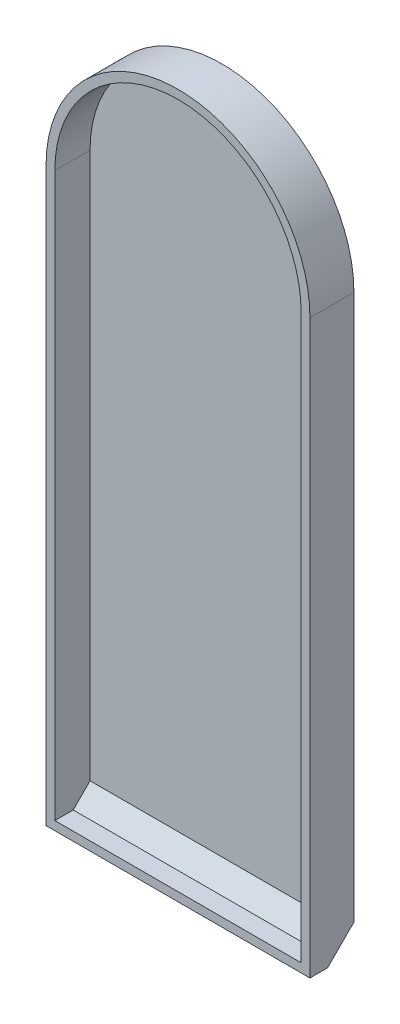
ISO-10303-21;
HEADER;
FILE_DESCRIPTION(('STEP AP214'),'2;1');
FILE_NAME('part.step','',(''),(''),'','','');
FILE_SCHEMA(('AUTOMOTIVE_DESIGN { 1 0 10303 214 1 1 1 1 }'));
ENDSEC;
DATA;
#1=APPLICATION_CONTEXT('core data for automotive mechanical design processes');
#2=APPLICATION_PROTOCOL_DEFINITION('international standard','automotive_design',2000,#1);
#3=PRODUCT_CONTEXT('',#1,'mechanical');
#4=PRODUCT('Part','Part','',(#3));
#5=PRODUCT_RELATED_PRODUCT_CATEGORY('part','',(#4));
#6=PRODUCT_DEFINITION_FORMATION('','',#4);
#7=PRODUCT_DEFINITION_CONTEXT('part definition',#1,'design');
#8=PRODUCT_DEFINITION('design','',#6,#7);
#9=PRODUCT_DEFINITION_SHAPE('','',#8);
#10=(LENGTH_UNIT() NAMED_UNIT(*) SI_UNIT(.MILLI.,.METRE.));
#11=(NAMED_UNIT(*) PLANE_ANGLE_UNIT() SI_UNIT($,.RADIAN.));
#12=(NAMED_UNIT(*) SI_UNIT($,.STERADIAN.) SOLID_ANGLE_UNIT());
#13=UNCERTAINTY_MEASURE_WITH_UNIT(LENGTH_MEASURE(1.E-05),#10,'distance_accuracy_value','');
#14=(GEOMETRIC_REPRESENTATION_CONTEXT(3) GLOBAL_UNCERTAINTY_ASSIGNED_CONTEXT((#13)) GLOBAL_UNIT_ASSIGNED_CONTEXT((#10,
#11,#12)) REPRESENTATION_CONTEXT('',''));
#15=CARTESIAN_POINT('',(0.,0.,0.));
#16=DIRECTION('',(0.,0.,1.));
#17=DIRECTION('',(1.,0.,0.));
#18=AXIS2_PLACEMENT_3D('',#15,#16,#17);
#19=CARTESIAN_POINT('',(-14.8736267350102,12.0050046276189,5.));
#20=DIRECTION('',(0.,0.,-1.));
#21=DIRECTION('',(-1.,0.,0.));
#22=AXIS2_PLACEMENT_3D('',#19,#20,#21);
#23=PLANE('',#22);
#24=CARTESIAN_POINT('',(-14.8736267350102,12.0050046276189,5.));
#25=DIRECTION('',(0.,0.,1.));
#26=DIRECTION('',(-1.,0.,0.));
#27=AXIS2_PLACEMENT_3D('',#24,#25,#26);
#28=CIRCLE('',#27,15.);
#29=CARTESIAN_POINT('',(0.126373264989783,12.0050046276189,5.));
#30=VERTEX_POINT('',#29);
#31=CARTESIAN_POINT('',(-29.8736267350102,12.0050046276189,5.));
#32=VERTEX_POINT('',#31);
#33=EDGE_CURVE('E194',#30,#32,#28,.T.);
#34=ORIENTED_EDGE('',*,*,#33,.T.);
#35=DIRECTION('',(0.,-1.,0.));
#36=VECTOR('',#35,1.);
#37=CARTESIAN_POINT('',(-29.8736267350102,12.0050046276189,5.));
#38=LINE('',#37,#36);
#39=CARTESIAN_POINT('',(-29.8736267350102,-52.9949953723811,5.));
#40=VERTEX_POINT('',#39);
#41=EDGE_CURVE('E198',#32,#40,#38,.T.);
#42=ORIENTED_EDGE('',*,*,#41,.T.);
#43=DIRECTION('',(1.,0.,0.));
#44=VECTOR('',#43,1.);
#45=CARTESIAN_POINT('',(-29.8736267350102,-52.9949953723811,5.));
#46=LINE('',#45,#44);
#47=CARTESIAN_POINT('',(0.126373264989793,-52.9949953723811,5.));
#48=VERTEX_POINT('',#47);
#49=EDGE_CURVE('E202',#40,#48,#46,.T.);
#50=ORIENTED_EDGE('',*,*,#49,.T.);
#51=DIRECTION('',(0.,1.,0.));
#52=VECTOR('',#51,1.);
#53=CARTESIAN_POINT('',(0.126373264989783,12.0050046276189,5.));
#54=LINE('',#53,#52);
#55=EDGE_CURVE('E205',#48,#30,#54,.T.);
#56=ORIENTED_EDGE('',*,*,#55,.T.);
#57=EDGE_LOOP('',(#34,#42,#50,#56));
#58=FACE_BOUND('',#57,.T.);
#59=CARTESIAN_POINT('',(-14.8736267350102,12.0050046276189,5.));
#60=DIRECTION('',(0.,0.,-1.));
#61=DIRECTION('',(-1.,0.,0.));
#62=AXIS2_PLACEMENT_3D('',#59,#60,#61);
#63=CIRCLE('',#62,14.);
#64=CARTESIAN_POINT('',(-0.873626735010217,12.0050046276189,5.));
#65=VERTEX_POINT('',#64);
#66=CARTESIAN_POINT('',(-28.8736267350102,12.0050046276189,5.));
#67=VERTEX_POINT('',#66);
#68=EDGE_CURVE('E152',#65,#67,#63,.F.);
#69=ORIENTED_EDGE('',*,*,#68,.F.);
#70=DIRECTION('',(0.,1.,0.));
#71=VECTOR('',#70,1.);
#72=CARTESIAN_POINT('',(-0.873626735010216,12.0050046276189,5.));
#73=LINE('',#72,#71);
#74=CARTESIAN_POINT('',(-0.873626735010207,-51.9949953723811,5.));
#75=VERTEX_POINT('',#74);
#76=EDGE_CURVE('E170',#75,#65,#73,.T.);
#77=ORIENTED_EDGE('',*,*,#76,.F.);
#78=DIRECTION('',(1.,0.,0.));
#79=VECTOR('',#78,1.);
#80=CARTESIAN_POINT('',(-14.8736267350102,-51.9949953723811,5.));
#81=LINE('',#80,#79);
#82=CARTESIAN_POINT('',(-28.8736267350102,-51.9949953723811,5.));
#83=VERTEX_POINT('',#82);
#84=EDGE_CURVE('E57',#83,#75,#81,.T.);
#85=ORIENTED_EDGE('',*,*,#84,.F.);
#86=DIRECTION('',(0.,-1.,0.));
#87=VECTOR('',#86,1.);
#88=CARTESIAN_POINT('',(-28.8736267350102,12.0050046276189,5.));
#89=LINE('',#88,#87);
#90=EDGE_CURVE('E181',#67,#83,#89,.T.);
#91=ORIENTED_EDGE('',*,*,#90,.F.);
#92=EDGE_LOOP('',(#69,#77,#85,#91));
#93=FACE_BOUND('',#92,.T.);
#94=ADVANCED_FACE('F41',(#58,#93),#23,.F.);
#95=CARTESIAN_POINT('',(-14.8736267350102,12.0050046276189,0.));
#96=DIRECTION('',(0.,0.,-1.));
#97=DIRECTION('',(-1.,0.,0.));
#98=AXIS2_PLACEMENT_3D('',#95,#96,#97);
#99=PLANE('',#98);
#100=DIRECTION('',(-0.707106781186547,-0.707106781186548,0.));
#101=VECTOR('',#100,1.);
#102=CARTESIAN_POINT('',(23.6263732649898,-26.494995372381,0.));
#103=LINE('',#102,#101);
#104=CARTESIAN_POINT('',(0.126373264989793,-49.9949953723811,0.));
#105=VERTEX_POINT('',#104);
#106=CARTESIAN_POINT('',(-0.373626735010162,-50.4949953723811,0.));
#107=VERTEX_POINT('',#106);
#108=EDGE_CURVE('E242',#105,#107,#103,.T.);
#109=ORIENTED_EDGE('',*,*,#108,.T.);
#110=DIRECTION('',(-1.,0.,0.));
#111=VECTOR('',#110,1.);
#112=CARTESIAN_POINT('',(-26.8736267350102,-50.4949953723811,0.));
#113=LINE('',#112,#111);
#114=CARTESIAN_POINT('',(-29.3736267350102,-50.4949953723811,0.));
#115=VERTEX_POINT('',#114);
#116=EDGE_CURVE('E50',#107,#115,#113,.T.);
#117=ORIENTED_EDGE('',*,*,#116,.T.);
#118=DIRECTION('',(-0.707106781186547,0.707106781186548,0.));
#119=VECTOR('',#118,1.);
#120=CARTESIAN_POINT('',(-53.3736267350102,-26.494995372381,0.));
#121=LINE('',#120,#119);
#122=CARTESIAN_POINT('',(-29.8736267350102,-49.9949953723811,0.));
#123=VERTEX_POINT('',#122);
#124=EDGE_CURVE('E239',#115,#123,#121,.T.);
#125=ORIENTED_EDGE('',*,*,#124,.T.);
#126=DIRECTION('',(0.,-1.,0.));
#127=VECTOR('',#126,1.);
#128=CARTESIAN_POINT('',(-29.8736267350102,12.0050046276189,0.));
#129=LINE('',#128,#127);
#130=CARTESIAN_POINT('',(-29.8736267350102,12.0050046276189,0.));
#131=VERTEX_POINT('',#130);
#132=EDGE_CURVE('E212',#131,#123,#129,.T.);
#133=ORIENTED_EDGE('',*,*,#132,.F.);
#134=CARTESIAN_POINT('',(-14.8736267350102,12.0050046276189,0.));
#135=DIRECTION('',(0.,0.,1.));
#136=DIRECTION('',(-1.,0.,0.));
#137=AXIS2_PLACEMENT_3D('',#134,#135,#136);
#138=CIRCLE('',#137,15.);
#139=CARTESIAN_POINT('',(0.126373264989783,12.0050046276189,0.));
#140=VERTEX_POINT('',#139);
#141=EDGE_CURVE('E193',#140,#131,#138,.T.);
#142=ORIENTED_EDGE('',*,*,#141,.F.);
#143=DIRECTION('',(0.,1.,0.));
#144=VECTOR('',#143,1.);
#145=CARTESIAN_POINT('',(0.126373264989783,12.0050046276189,0.));
#146=LINE('',#145,#144);
#147=EDGE_CURVE('E199',#105,#140,#146,.T.);
#148=ORIENTED_EDGE('',*,*,#147,.F.);
#149=EDGE_LOOP('',(#109,#117,#125,#133,#142,#148));
#150=FACE_BOUND('',#149,.T.);
#151=ADVANCED_FACE('F278',(#150),#99,.T.);
#152=CARTESIAN_POINT('',(-14.8736267350102,12.0050046276189,5.));
#153=DIRECTION('',(0.,0.,-1.));
#154=DIRECTION('',(-1.,0.,0.));
#155=AXIS2_PLACEMENT_3D('',#152,#153,#154);
#156=CYLINDRICAL_SURFACE('',#155,15.);
#157=ORIENTED_EDGE('',*,*,#141,.T.);
#158=DIRECTION('',(0.,0.,-1.));
#159=VECTOR('',#158,1.);
#160=CARTESIAN_POINT('',(-29.8736267350102,12.0050046276189,5.));
#161=LINE('',#160,#159);
#162=EDGE_CURVE('E228',#32,#131,#161,.T.);
#163=ORIENTED_EDGE('',*,*,#162,.F.);
#164=ORIENTED_EDGE('',*,*,#33,.F.);
#165=DIRECTION('',(0.,0.,-1.));
#166=VECTOR('',#165,1.);
#167=CARTESIAN_POINT('',(0.126373264989783,12.0050046276189,5.));
#168=LINE('',#167,#166);
#169=EDGE_CURVE('E208',#30,#140,#168,.T.);
#170=ORIENTED_EDGE('',*,*,#169,.T.);
#171=EDGE_LOOP('',(#157,#163,#164,#170));
#172=FACE_BOUND('',#171,.T.);
#173=ADVANCED_FACE('F284',(#172),#156,.T.);
#174=CARTESIAN_POINT('',(-29.8736267350102,12.0050046276189,5.));
#175=DIRECTION('',(1.,0.,0.));
#176=DIRECTION('',(0.,1.,0.));
#177=AXIS2_PLACEMENT_3D('',#174,#175,#176);
#178=PLANE('',#177);
#179=DIRECTION('',(0.,0.707106781186548,-0.707106781186547));
#180=VECTOR('',#179,1.);
#181=CARTESIAN_POINT('',(-29.8736267350102,-21.494995372381,-28.5));
#182=LINE('',#181,#180);
#183=CARTESIAN_POINT('',(-29.8736267350102,-52.9949953723811,3.00000000000001));
#184=VERTEX_POINT('',#183);
#185=EDGE_CURVE('E232',#184,#123,#182,.T.);
#186=ORIENTED_EDGE('',*,*,#185,.F.);
#187=DIRECTION('',(0.,0.,-1.));
#188=VECTOR('',#187,1.);
#189=CARTESIAN_POINT('',(-29.8736267350102,-52.9949953723811,5.));
#190=LINE('',#189,#188);
#191=EDGE_CURVE('E224',#40,#184,#190,.T.);
#192=ORIENTED_EDGE('',*,*,#191,.F.);
#193=ORIENTED_EDGE('',*,*,#41,.F.);
#194=ORIENTED_EDGE('',*,*,#162,.T.);
#195=ORIENTED_EDGE('',*,*,#132,.T.);
#196=EDGE_LOOP('',(#186,#192,#193,#194,#195));
#197=FACE_BOUND('',#196,.T.);
#198=ADVANCED_FACE('F297',(#197),#178,.F.);
#199=CARTESIAN_POINT('',(-29.8736267350102,-52.9949953723811,5.));
#200=DIRECTION('',(0.,1.,0.));
#201=DIRECTION('',(0.,0.,1.));
#202=AXIS2_PLACEMENT_3D('',#199,#200,#201);
#203=PLANE('',#202);
#204=DIRECTION('',(-0.707106781186547,0.,0.707106781186548));
#205=VECTOR('',#204,1.);
#206=CARTESIAN_POINT('',(-30.8736267350102,-52.9949953723811,4.00000000000001));
#207=LINE('',#206,#205);
#208=CARTESIAN_POINT('',(-29.3736267350102,-52.9949953723811,2.50000000000002));
#209=VERTEX_POINT('',#208);
#210=EDGE_CURVE('E236',#209,#184,#207,.T.);
#211=ORIENTED_EDGE('',*,*,#210,.F.);
#212=DIRECTION('',(1.,0.,0.));
#213=VECTOR('',#212,1.);
#214=CARTESIAN_POINT('',(-2.87362673501019,-52.9949953723811,2.50000000000002));
#215=LINE('',#214,#213);
#216=CARTESIAN_POINT('',(-0.373626735010169,-52.9949953723811,2.50000000000002));
#217=VERTEX_POINT('',#216);
#218=EDGE_CURVE('E253',#209,#217,#215,.T.);
#219=ORIENTED_EDGE('',*,*,#218,.T.);
#220=DIRECTION('',(-0.707106781186548,0.,-0.707106781186548));
#221=VECTOR('',#220,1.);
#222=CARTESIAN_POINT('',(-13.8736267350102,-52.9949953723811,-11.));
#223=LINE('',#222,#221);
#224=CARTESIAN_POINT('',(0.126373264989795,-52.9949953723811,2.99999999999998));
#225=VERTEX_POINT('',#224);
#226=EDGE_CURVE('E245',#225,#217,#223,.T.);
#227=ORIENTED_EDGE('',*,*,#226,.F.);
#228=DIRECTION('',(0.,0.,-1.));
#229=VECTOR('',#228,1.);
#230=CARTESIAN_POINT('',(0.126373264989793,-52.9949953723811,5.));
#231=LINE('',#230,#229);
#232=EDGE_CURVE('E221',#48,#225,#231,.T.);
#233=ORIENTED_EDGE('',*,*,#232,.F.);
#234=ORIENTED_EDGE('',*,*,#49,.F.);
#235=ORIENTED_EDGE('',*,*,#191,.T.);
#236=EDGE_LOOP('',(#211,#219,#227,#233,#234,#235));
#237=FACE_BOUND('',#236,.T.);
#238=ADVANCED_FACE('F293',(#237),#203,.F.);
#239=CARTESIAN_POINT('',(0.126373264989783,12.0050046276189,5.));
#240=DIRECTION('',(-1.,0.,0.));
#241=DIRECTION('',(0.,-1.,0.));
#242=AXIS2_PLACEMENT_3D('',#239,#240,#241);
#243=PLANE('',#242);
#244=DIRECTION('',(0.,-0.707106781186548,0.707106781186547));
#245=VECTOR('',#244,1.);
#246=CARTESIAN_POINT('',(0.126373264989788,-21.494995372381,-28.5));
#247=LINE('',#246,#245);
#248=EDGE_CURVE('E249',#105,#225,#247,.T.);
#249=ORIENTED_EDGE('',*,*,#248,.F.);
#250=ORIENTED_EDGE('',*,*,#147,.T.);
#251=ORIENTED_EDGE('',*,*,#169,.F.);
#252=ORIENTED_EDGE('',*,*,#55,.F.);
#253=ORIENTED_EDGE('',*,*,#232,.T.);
#254=EDGE_LOOP('',(#249,#250,#251,#252,#253));
#255=FACE_BOUND('',#254,.T.);
#256=ADVANCED_FACE('F290',(#255),#243,.F.);
#257=CARTESIAN_POINT('',(-26.6228740357971,-26.6228740357971,-26.6228740357971));
#258=DIRECTION('',(-0.577350269189626,-0.577350269189625,-0.577350269189626));
#259=DIRECTION('',(-0.707106781186547,0.,0.707106781186548));
#260=AXIS2_PLACEMENT_3D('',#257,#258,#259);
#261=PLANE('',#260);
#262=ORIENTED_EDGE('',*,*,#124,.F.);
#263=DIRECTION('',(0.,-0.707106781186548,0.707106781186546));
#264=VECTOR('',#263,1.);
#265=CARTESIAN_POINT('',(-29.3736267350103,-25.2474976861905,-25.2474976861905));
#266=LINE('',#265,#264);
#267=EDGE_CURVE('E11',#115,#209,#266,.T.);
#268=ORIENTED_EDGE('',*,*,#267,.T.);
#269=ORIENTED_EDGE('',*,*,#210,.T.);
#270=ORIENTED_EDGE('',*,*,#185,.T.);
#271=EDGE_LOOP('',(#262,#268,#269,#270));
#272=FACE_BOUND('',#271,.T.);
#273=ADVANCED_FACE('F287',(#272),#261,.T.);
#274=CARTESIAN_POINT('',(16.7071228791236,-16.7071228791236,-16.7071228791236));
#275=DIRECTION('',(0.577350269189626,-0.577350269189625,-0.577350269189626));
#276=DIRECTION('',(-0.707106781186548,0.,-0.707106781186548));
#277=AXIS2_PLACEMENT_3D('',#274,#275,#276);
#278=PLANE('',#277);
#279=ORIENTED_EDGE('',*,*,#226,.T.);
#280=DIRECTION('',(0.,0.707106781186548,-0.707106781186547));
#281=VECTOR('',#280,1.);
#282=CARTESIAN_POINT('',(-0.373626735010145,-25.2474976861905,-25.2474976861905));
#283=LINE('',#282,#281);
#284=EDGE_CURVE('E257',#217,#107,#283,.T.);
#285=ORIENTED_EDGE('',*,*,#284,.T.);
#286=ORIENTED_EDGE('',*,*,#108,.F.);
#287=ORIENTED_EDGE('',*,*,#248,.T.);
#288=EDGE_LOOP('',(#279,#285,#286,#287));
#289=FACE_BOUND('',#288,.T.);
#290=ADVANCED_FACE('F318',(#289),#278,.T.);
#291=CARTESIAN_POINT('',(-29.8736267350102,-52.9949953723811,2.50000000000002));
#292=DIRECTION('',(0.,-0.707106781186547,-0.707106781186549));
#293=DIRECTION('',(-1.,0.,0.));
#294=AXIS2_PLACEMENT_3D('',#291,#292,#293);
#295=PLANE('',#294);
#296=ORIENTED_EDGE('',*,*,#267,.F.);
#297=ORIENTED_EDGE('',*,*,#116,.F.);
#298=ORIENTED_EDGE('',*,*,#284,.F.);
#299=ORIENTED_EDGE('',*,*,#218,.F.);
#300=EDGE_LOOP('',(#296,#297,#298,#299));
#301=FACE_BOUND('',#300,.T.);
#302=ADVANCED_FACE('F43',(#301),#295,.T.);
#303=CARTESIAN_POINT('',(-14.8736267350102,12.0050046276189,1.));
#304=DIRECTION('',(0.,0.,-1.));
#305=DIRECTION('',(-1.,0.,0.));
#306=AXIS2_PLACEMENT_3D('',#303,#304,#305);
#307=PLANE('',#306);
#308=DIRECTION('',(0.,1.,0.));
#309=VECTOR('',#308,1.);
#310=CARTESIAN_POINT('',(-0.873626735010216,12.0050046276189,1.));
#311=LINE('',#310,#309);
#312=CARTESIAN_POINT('',(-0.873626735010209,-50.080781810008,1.));
#313=VERTEX_POINT('',#312);
#314=CARTESIAN_POINT('',(-0.873626735010216,12.0050046276189,1.));
#315=VERTEX_POINT('',#314);
#316=EDGE_CURVE('E144',#313,#315,#311,.T.);
#317=ORIENTED_EDGE('',*,*,#316,.T.);
#318=CARTESIAN_POINT('',(-14.8736267350102,12.0050046276189,1.));
#319=DIRECTION('',(0.,0.,-1.));
#320=DIRECTION('',(-1.,0.,0.));
#321=AXIS2_PLACEMENT_3D('',#318,#319,#320);
#322=CIRCLE('',#321,14.);
#323=CARTESIAN_POINT('',(-28.8736267350102,12.0050046276189,1.));
#324=VERTEX_POINT('',#323);
#325=EDGE_CURVE('E145',#315,#324,#322,.F.);
#326=ORIENTED_EDGE('',*,*,#325,.T.);
#327=DIRECTION('',(0.,-1.,0.));
#328=VECTOR('',#327,1.);
#329=CARTESIAN_POINT('',(-28.8736267350102,12.0050046276189,1.));
#330=LINE('',#329,#328);
#331=CARTESIAN_POINT('',(-28.8736267350102,-50.080781810008,1.));
#332=VERTEX_POINT('',#331);
#333=EDGE_CURVE('E132',#324,#332,#330,.T.);
#334=ORIENTED_EDGE('',*,*,#333,.T.);
#335=DIRECTION('',(-1.,0.,0.));
#336=VECTOR('',#335,1.);
#337=CARTESIAN_POINT('',(-14.8736267350102,-50.080781810008,1.));
#338=LINE('',#337,#336);
#339=EDGE_CURVE('E176',#313,#332,#338,.T.);
#340=ORIENTED_EDGE('',*,*,#339,.F.);
#341=EDGE_LOOP('',(#317,#326,#334,#340));
#342=FACE_BOUND('',#341,.T.);
#343=ADVANCED_FACE('F157',(#342),#307,.F.);
#344=CARTESIAN_POINT('',(-14.8736267350102,12.0050046276189,5.));
#345=DIRECTION('',(0.,0.,-1.));
#346=DIRECTION('',(-1.,0.,0.));
#347=AXIS2_PLACEMENT_3D('',#344,#345,#346);
#348=CYLINDRICAL_SURFACE('',#347,14.);
#349=ORIENTED_EDGE('',*,*,#325,.F.);
#350=DIRECTION('',(0.,0.,-1.));
#351=VECTOR('',#350,1.);
#352=CARTESIAN_POINT('',(-0.873626735010216,12.0050046276189,5.));
#353=LINE('',#352,#351);
#354=EDGE_CURVE('E166',#65,#315,#353,.T.);
#355=ORIENTED_EDGE('',*,*,#354,.F.);
#356=ORIENTED_EDGE('',*,*,#68,.T.);
#357=DIRECTION('',(0.,0.,1.));
#358=VECTOR('',#357,1.);
#359=CARTESIAN_POINT('',(-28.8736267350102,12.0050046276189,5.));
#360=LINE('',#359,#358);
#361=EDGE_CURVE('E135',#67,#324,#360,.F.);
#362=ORIENTED_EDGE('',*,*,#361,.T.);
#363=EDGE_LOOP('',(#349,#355,#356,#362));
#364=FACE_BOUND('',#363,.T.);
#365=ADVANCED_FACE('F149',(#364),#348,.F.);
#366=CARTESIAN_POINT('',(-28.8736267350102,12.0050046276189,5.));
#367=DIRECTION('',(1.,0.,0.));
#368=DIRECTION('',(0.,1.,0.));
#369=AXIS2_PLACEMENT_3D('',#366,#367,#368);
#370=PLANE('',#369);
#371=ORIENTED_EDGE('',*,*,#333,.F.);
#372=ORIENTED_EDGE('',*,*,#361,.F.);
#373=ORIENTED_EDGE('',*,*,#90,.T.);
#374=DIRECTION('',(0.,0.,-1.));
#375=VECTOR('',#374,1.);
#376=CARTESIAN_POINT('',(-28.8736267350102,-51.9949953723811,5.));
#377=LINE('',#376,#375);
#378=CARTESIAN_POINT('',(-28.8736267350102,-51.9949953723811,2.91421356237311));
#379=VERTEX_POINT('',#378);
#380=EDGE_CURVE('E155',#83,#379,#377,.T.);
#381=ORIENTED_EDGE('',*,*,#380,.T.);
#382=DIRECTION('',(0.,-0.707106781186549,0.707106781186547));
#383=VECTOR('',#382,1.);
#384=CARTESIAN_POINT('',(-28.8736267350102,-52.2878885911945,3.20710678118656));
#385=LINE('',#384,#383);
#386=EDGE_CURVE('E138',#332,#379,#385,.T.);
#387=ORIENTED_EDGE('',*,*,#386,.F.);
#388=EDGE_LOOP('',(#371,#372,#373,#381,#387));
#389=FACE_BOUND('',#388,.T.);
#390=ADVANCED_FACE('F134',(#389),#370,.T.);
#391=CARTESIAN_POINT('',(-29.8736267350102,-51.9949953723811,5.));
#392=DIRECTION('',(0.,1.,0.));
#393=DIRECTION('',(0.,0.,1.));
#394=AXIS2_PLACEMENT_3D('',#391,#392,#393);
#395=PLANE('',#394);
#396=ORIENTED_EDGE('',*,*,#380,.F.);
#397=ORIENTED_EDGE('',*,*,#84,.T.);
#398=DIRECTION('',(0.,0.,-1.));
#399=VECTOR('',#398,1.);
#400=CARTESIAN_POINT('',(-0.873626735010207,-51.9949953723811,5.));
#401=LINE('',#400,#399);
#402=CARTESIAN_POINT('',(-0.873626735010207,-51.9949953723811,2.91421356237311));
#403=VERTEX_POINT('',#402);
#404=EDGE_CURVE('E169',#75,#403,#401,.T.);
#405=ORIENTED_EDGE('',*,*,#404,.T.);
#406=DIRECTION('',(1.,0.,0.));
#407=VECTOR('',#406,1.);
#408=CARTESIAN_POINT('',(-29.8736267350102,-51.9949953723811,2.91421356237311));
#409=LINE('',#408,#407);
#410=EDGE_CURVE('E154',#379,#403,#409,.T.);
#411=ORIENTED_EDGE('',*,*,#410,.F.);
#412=EDGE_LOOP('',(#396,#397,#405,#411));
#413=FACE_BOUND('',#412,.T.);
#414=ADVANCED_FACE('F268',(#413),#395,.T.);
#415=CARTESIAN_POINT('',(-0.873626735010217,12.0050046276189,5.));
#416=DIRECTION('',(-1.,0.,0.));
#417=DIRECTION('',(0.,-1.,0.));
#418=AXIS2_PLACEMENT_3D('',#415,#416,#417);
#419=PLANE('',#418);
#420=DIRECTION('',(0.,-0.707106781186549,0.707106781186547));
#421=VECTOR('',#420,1.);
#422=CARTESIAN_POINT('',(-0.873626735010212,-21.0378885911944,-28.0428932188135));
#423=LINE('',#422,#421);
#424=EDGE_CURVE('E188',#313,#403,#423,.T.);
#425=ORIENTED_EDGE('',*,*,#424,.T.);
#426=ORIENTED_EDGE('',*,*,#404,.F.);
#427=ORIENTED_EDGE('',*,*,#76,.T.);
#428=ORIENTED_EDGE('',*,*,#354,.T.);
#429=ORIENTED_EDGE('',*,*,#316,.F.);
#430=EDGE_LOOP('',(#425,#426,#427,#428,#429));
#431=FACE_BOUND('',#430,.T.);
#432=ADVANCED_FACE('F265',(#431),#419,.T.);
#433=CARTESIAN_POINT('',(-29.8736267350102,-52.2878885911945,3.20710678118656));
#434=DIRECTION('',(0.,-0.707106781186547,-0.707106781186549));
#435=DIRECTION('',(-1.,0.,0.));
#436=AXIS2_PLACEMENT_3D('',#433,#434,#435);
#437=PLANE('',#436);
#438=ORIENTED_EDGE('',*,*,#386,.T.);
#439=ORIENTED_EDGE('',*,*,#410,.T.);
#440=ORIENTED_EDGE('',*,*,#424,.F.);
#441=ORIENTED_EDGE('',*,*,#339,.T.);
#442=EDGE_LOOP('',(#438,#439,#440,#441));
#443=FACE_BOUND('',#442,.T.);
#444=ADVANCED_FACE('F262',(#443),#437,.F.);
#445=CLOSED_SHELL('',(#94,#151,#173,#198,#238,#256,#273,#290,#302,#343,#365,#390,#414,#432,#444));
#446=MANIFOLD_SOLID_BREP('B2',#445);
#447=ADVANCED_BREP_SHAPE_REPRESENTATION('',(#18,#446),#14);
#448=SHAPE_DEFINITION_REPRESENTATION(#9,#447);
ENDSEC;
END-ISO-10303-21;
